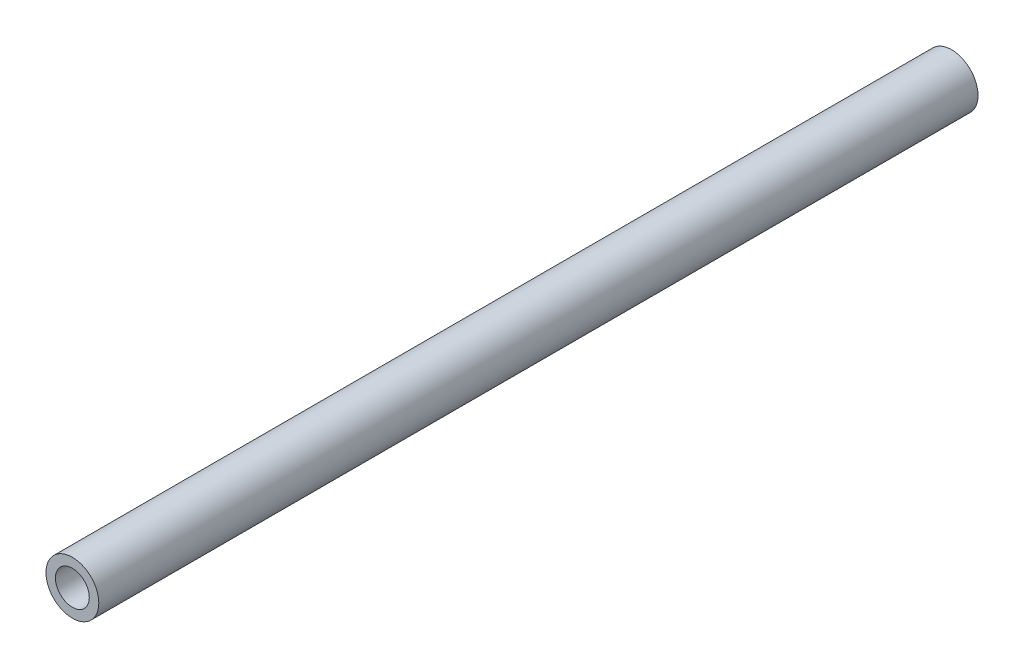
ISO-10303-21;
HEADER;
FILE_DESCRIPTION(('STEP AP214'),'2;1');
FILE_NAME('part.step','',(''),(''),'','','');
FILE_SCHEMA(('AUTOMOTIVE_DESIGN { 1 0 10303 214 1 1 1 1 }'));
ENDSEC;
DATA;
#1=APPLICATION_CONTEXT('core data for automotive mechanical design processes');
#2=APPLICATION_PROTOCOL_DEFINITION('international standard','automotive_design',2000,#1);
#3=PRODUCT_CONTEXT('',#1,'mechanical');
#4=PRODUCT('Part','Part','',(#3));
#5=PRODUCT_RELATED_PRODUCT_CATEGORY('part','',(#4));
#6=PRODUCT_DEFINITION_FORMATION('','',#4);
#7=PRODUCT_DEFINITION_CONTEXT('part definition',#1,'design');
#8=PRODUCT_DEFINITION('design','',#6,#7);
#9=PRODUCT_DEFINITION_SHAPE('','',#8);
#10=(LENGTH_UNIT() NAMED_UNIT(*) SI_UNIT(.MILLI.,.METRE.));
#11=(NAMED_UNIT(*) PLANE_ANGLE_UNIT() SI_UNIT($,.RADIAN.));
#12=(NAMED_UNIT(*) SI_UNIT($,.STERADIAN.) SOLID_ANGLE_UNIT());
#13=UNCERTAINTY_MEASURE_WITH_UNIT(LENGTH_MEASURE(1.E-05),#10,'distance_accuracy_value','');
#14=(GEOMETRIC_REPRESENTATION_CONTEXT(3) GLOBAL_UNCERTAINTY_ASSIGNED_CONTEXT((#13)) GLOBAL_UNIT_ASSIGNED_CONTEXT((#10,
#11,#12)) REPRESENTATION_CONTEXT('',''));
#15=CARTESIAN_POINT('',(0.,0.,0.));
#16=DIRECTION('',(0.,0.,1.));
#17=DIRECTION('',(1.,0.,0.));
#18=AXIS2_PLACEMENT_3D('',#15,#16,#17);
#19=CARTESIAN_POINT('',(0.,0.,83.18));
#20=DIRECTION('',(0.,0.,1.));
#21=DIRECTION('',(1.,0.,0.));
#22=AXIS2_PLACEMENT_3D('',#19,#20,#21);
#23=PLANE('',#22);
#24=CARTESIAN_POINT('',(0.,0.,83.18));
#25=DIRECTION('',(0.,0.,1.));
#26=DIRECTION('',(1.,0.,0.));
#27=AXIS2_PLACEMENT_3D('',#24,#25,#26);
#28=CIRCLE('',#27,2.5);
#29=CARTESIAN_POINT('',(2.5,0.,83.18));
#30=VERTEX_POINT('',#29);
#31=EDGE_CURVE('E10',#30,#30,#28,.T.);
#32=ORIENTED_EDGE('',*,*,#31,.T.);
#33=EDGE_LOOP('',(#32));
#34=FACE_BOUND('',#33,.T.);
#35=CARTESIAN_POINT('',(0.,0.,83.18));
#36=DIRECTION('',(0.,0.,1.));
#37=DIRECTION('',(1.,0.,0.));
#38=AXIS2_PLACEMENT_3D('',#35,#36,#37);
#39=CIRCLE('',#38,1.6);
#40=CARTESIAN_POINT('',(1.6,0.,83.18));
#41=VERTEX_POINT('',#40);
#42=EDGE_CURVE('E43',#41,#41,#39,.T.);
#43=ORIENTED_EDGE('',*,*,#42,.F.);
#44=EDGE_LOOP('',(#43));
#45=FACE_BOUND('',#44,.T.);
#46=ADVANCED_FACE('F32',(#34,#45),#23,.T.);
#47=CARTESIAN_POINT('',(0.,0.,0.));
#48=DIRECTION('',(0.,0.,1.));
#49=DIRECTION('',(1.,0.,0.));
#50=AXIS2_PLACEMENT_3D('',#47,#48,#49);
#51=PLANE('',#50);
#52=CARTESIAN_POINT('',(0.,0.,0.));
#53=DIRECTION('',(0.,0.,1.));
#54=DIRECTION('',(1.,0.,0.));
#55=AXIS2_PLACEMENT_3D('',#52,#53,#54);
#56=CIRCLE('',#55,2.5);
#57=CARTESIAN_POINT('',(2.5,0.,0.));
#58=VERTEX_POINT('',#57);
#59=EDGE_CURVE('E36',#58,#58,#56,.T.);
#60=ORIENTED_EDGE('',*,*,#59,.F.);
#61=EDGE_LOOP('',(#60));
#62=FACE_BOUND('',#61,.T.);
#63=CARTESIAN_POINT('',(0.,0.,0.));
#64=DIRECTION('',(0.,0.,1.));
#65=DIRECTION('',(1.,0.,0.));
#66=AXIS2_PLACEMENT_3D('',#63,#64,#65);
#67=CIRCLE('',#66,1.6);
#68=CARTESIAN_POINT('',(1.6,0.,0.));
#69=VERTEX_POINT('',#68);
#70=EDGE_CURVE('E45',#69,#69,#67,.T.);
#71=ORIENTED_EDGE('',*,*,#70,.T.);
#72=EDGE_LOOP('',(#71));
#73=FACE_BOUND('',#72,.T.);
#74=ADVANCED_FACE('F55',(#62,#73),#51,.F.);
#75=CARTESIAN_POINT('',(0.,0.,83.18));
#76=DIRECTION('',(0.,0.,-1.));
#77=DIRECTION('',(-1.,0.,0.));
#78=AXIS2_PLACEMENT_3D('',#75,#76,#77);
#79=CYLINDRICAL_SURFACE('',#78,2.5);
#80=ORIENTED_EDGE('',*,*,#31,.F.);
#81=EDGE_LOOP('',(#80));
#82=FACE_BOUND('',#81,.T.);
#83=ORIENTED_EDGE('',*,*,#59,.T.);
#84=EDGE_LOOP('',(#83));
#85=FACE_BOUND('',#84,.T.);
#86=ADVANCED_FACE('F34',(#82,#85),#79,.T.);
#87=CARTESIAN_POINT('',(0.,0.,83.18));
#88=DIRECTION('',(0.,0.,-1.));
#89=DIRECTION('',(-1.,0.,0.));
#90=AXIS2_PLACEMENT_3D('',#87,#88,#89);
#91=CYLINDRICAL_SURFACE('',#90,1.6);
#92=ORIENTED_EDGE('',*,*,#42,.T.);
#93=EDGE_LOOP('',(#92));
#94=FACE_BOUND('',#93,.T.);
#95=ORIENTED_EDGE('',*,*,#70,.F.);
#96=EDGE_LOOP('',(#95));
#97=FACE_BOUND('',#96,.T.);
#98=ADVANCED_FACE('F51',(#94,#97),#91,.F.);
#99=CLOSED_SHELL('',(#46,#74,#86,#98));
#100=MANIFOLD_SOLID_BREP('B2',#99);
#101=ADVANCED_BREP_SHAPE_REPRESENTATION('',(#18,#100),#14);
#102=SHAPE_DEFINITION_REPRESENTATION(#9,#101);
ENDSEC;
END-ISO-10303-21;
